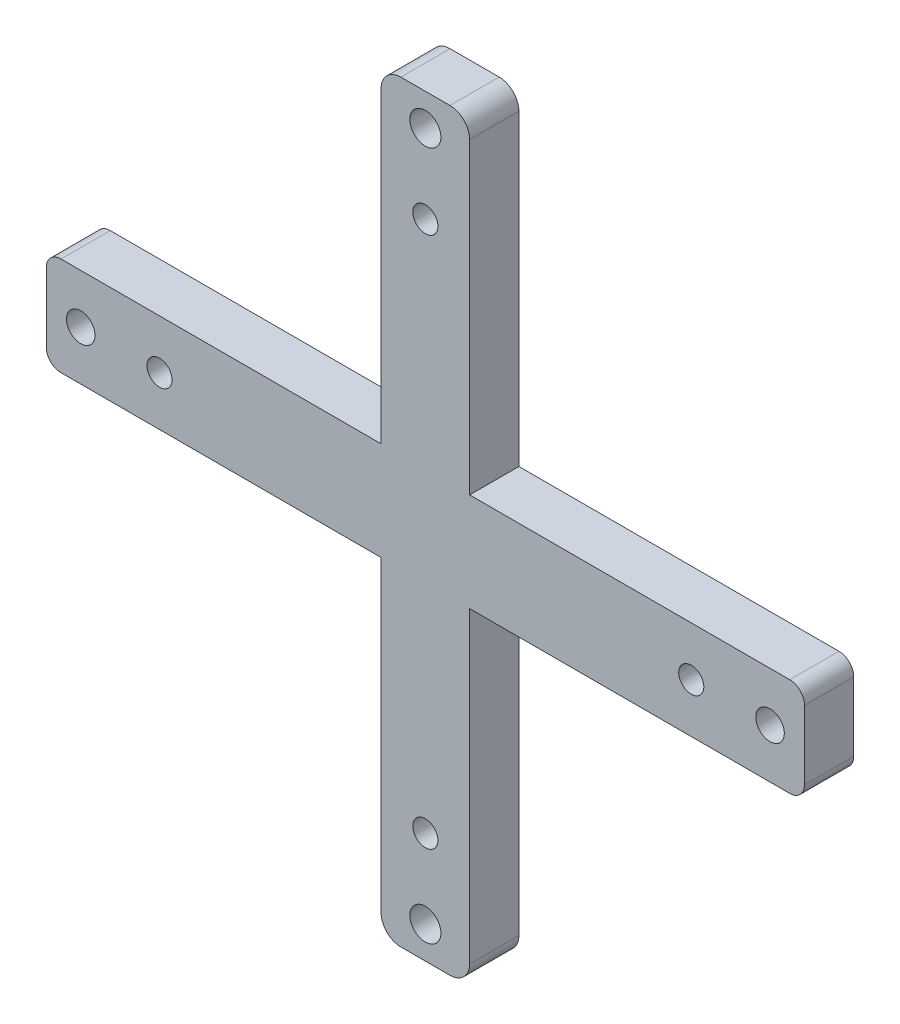
ISO-10303-21;
HEADER;
FILE_DESCRIPTION(('STEP AP214'),'2;1');
FILE_NAME('part.step','',(''),(''),'','','');
FILE_SCHEMA(('AUTOMOTIVE_DESIGN { 1 0 10303 214 1 1 1 1 }'));
ENDSEC;
DATA;
#1=APPLICATION_CONTEXT('core data for automotive mechanical design processes');
#2=APPLICATION_PROTOCOL_DEFINITION('international standard','automotive_design',2000,#1);
#3=PRODUCT_CONTEXT('',#1,'mechanical');
#4=PRODUCT('Part','Part','',(#3));
#5=PRODUCT_RELATED_PRODUCT_CATEGORY('part','',(#4));
#6=PRODUCT_DEFINITION_FORMATION('','',#4);
#7=PRODUCT_DEFINITION_CONTEXT('part definition',#1,'design');
#8=PRODUCT_DEFINITION('design','',#6,#7);
#9=PRODUCT_DEFINITION_SHAPE('','',#8);
#10=(LENGTH_UNIT() NAMED_UNIT(*) SI_UNIT(.MILLI.,.METRE.));
#11=(NAMED_UNIT(*) PLANE_ANGLE_UNIT() SI_UNIT($,.RADIAN.));
#12=(NAMED_UNIT(*) SI_UNIT($,.STERADIAN.) SOLID_ANGLE_UNIT());
#13=UNCERTAINTY_MEASURE_WITH_UNIT(LENGTH_MEASURE(1.E-05),#10,'distance_accuracy_value','');
#14=(GEOMETRIC_REPRESENTATION_CONTEXT(3) GLOBAL_UNCERTAINTY_ASSIGNED_CONTEXT((#13)) GLOBAL_UNIT_ASSIGNED_CONTEXT((#10,
#11,#12)) REPRESENTATION_CONTEXT('',''));
#15=CARTESIAN_POINT('',(0.,0.,0.));
#16=DIRECTION('',(0.,0.,1.));
#17=DIRECTION('',(1.,0.,0.));
#18=AXIS2_PLACEMENT_3D('',#15,#16,#17);
#19=CARTESIAN_POINT('',(0.,-88.9,0.));
#20=DIRECTION('',(0.,0.,1.));
#21=DIRECTION('',(1.,0.,0.));
#22=AXIS2_PLACEMENT_3D('',#19,#20,#21);
#23=CYLINDRICAL_SURFACE('',#22,4.);
#24=CARTESIAN_POINT('',(0.,-88.9,12.7));
#25=DIRECTION('',(0.,0.,1.));
#26=DIRECTION('',(1.,0.,0.));
#27=AXIS2_PLACEMENT_3D('',#24,#25,#26);
#28=CIRCLE('',#27,4.);
#29=CARTESIAN_POINT('',(4.,-88.9,12.7));
#30=VERTEX_POINT('',#29);
#31=EDGE_CURVE('E821',#30,#30,#28,.T.);
#32=ORIENTED_EDGE('',*,*,#31,.T.);
#33=EDGE_LOOP('',(#32));
#34=FACE_BOUND('',#33,.T.);
#35=CARTESIAN_POINT('',(0.,-88.9,6.35));
#36=DIRECTION('',(0.,0.,-1.));
#37=DIRECTION('',(-1.,0.,0.));
#38=AXIS2_PLACEMENT_3D('',#35,#36,#37);
#39=CIRCLE('',#38,4.);
#40=CARTESIAN_POINT('',(-4.,-88.9,6.35));
#41=VERTEX_POINT('',#40);
#42=EDGE_CURVE('E11',#41,#41,#39,.F.);
#43=ORIENTED_EDGE('',*,*,#42,.F.);
#44=EDGE_LOOP('',(#43));
#45=FACE_BOUND('',#44,.T.);
#46=ADVANCED_FACE('F36',(#34,#45),#23,.F.);
#47=CARTESIAN_POINT('',(0.,88.9,0.));
#48=DIRECTION('',(0.,0.,1.));
#49=DIRECTION('',(1.,0.,0.));
#50=AXIS2_PLACEMENT_3D('',#47,#48,#49);
#51=CYLINDRICAL_SURFACE('',#50,4.);
#52=CARTESIAN_POINT('',(0.,88.9,12.7));
#53=DIRECTION('',(0.,0.,1.));
#54=DIRECTION('',(1.,0.,0.));
#55=AXIS2_PLACEMENT_3D('',#52,#53,#54);
#56=CIRCLE('',#55,4.);
#57=CARTESIAN_POINT('',(4.,88.9,12.7));
#58=VERTEX_POINT('',#57);
#59=EDGE_CURVE('E206',#58,#58,#56,.T.);
#60=ORIENTED_EDGE('',*,*,#59,.T.);
#61=EDGE_LOOP('',(#60));
#62=FACE_BOUND('',#61,.T.);
#63=CARTESIAN_POINT('',(0.,88.9,6.35));
#64=DIRECTION('',(0.,0.,-1.));
#65=DIRECTION('',(-1.,0.,0.));
#66=AXIS2_PLACEMENT_3D('',#63,#64,#65);
#67=CIRCLE('',#66,4.);
#68=CARTESIAN_POINT('',(-4.,88.9,6.35));
#69=VERTEX_POINT('',#68);
#70=EDGE_CURVE('E44',#69,#69,#67,.F.);
#71=ORIENTED_EDGE('',*,*,#70,.F.);
#72=EDGE_LOOP('',(#71));
#73=FACE_BOUND('',#72,.T.);
#74=ADVANCED_FACE('F340',(#62,#73),#51,.F.);
#75=CARTESIAN_POINT('',(-88.9,0.,12.7));
#76=DIRECTION('',(0.,0.,-1.));
#77=DIRECTION('',(-1.,0.,0.));
#78=AXIS2_PLACEMENT_3D('',#75,#76,#77);
#79=CYLINDRICAL_SURFACE('',#78,3.683);
#80=CARTESIAN_POINT('',(-88.9,0.,12.7));
#81=DIRECTION('',(0.,0.,1.));
#82=DIRECTION('',(1.,0.,0.));
#83=AXIS2_PLACEMENT_3D('',#80,#81,#82);
#84=CIRCLE('',#83,3.683);
#85=CARTESIAN_POINT('',(-85.217,0.,12.7));
#86=VERTEX_POINT('',#85);
#87=EDGE_CURVE('E261',#86,#86,#84,.T.);
#88=ORIENTED_EDGE('',*,*,#87,.T.);
#89=EDGE_LOOP('',(#88));
#90=FACE_BOUND('',#89,.T.);
#91=CARTESIAN_POINT('',(-88.9,0.,6.35));
#92=DIRECTION('',(0.,0.,-1.));
#93=DIRECTION('',(-1.,0.,0.));
#94=AXIS2_PLACEMENT_3D('',#91,#92,#93);
#95=CIRCLE('',#94,3.68300000000001);
#96=CARTESIAN_POINT('',(-92.583,0.,6.35));
#97=VERTEX_POINT('',#96);
#98=EDGE_CURVE('E797',#97,#97,#95,.T.);
#99=ORIENTED_EDGE('',*,*,#98,.T.);
#100=EDGE_LOOP('',(#99));
#101=FACE_BOUND('',#100,.T.);
#102=ADVANCED_FACE('F342',(#90,#101),#79,.F.);
#103=CARTESIAN_POINT('',(88.9,0.,12.7));
#104=DIRECTION('',(0.,0.,-1.));
#105=DIRECTION('',(-1.,0.,0.));
#106=AXIS2_PLACEMENT_3D('',#103,#104,#105);
#107=CYLINDRICAL_SURFACE('',#106,3.683);
#108=CARTESIAN_POINT('',(88.9,0.,12.7));
#109=DIRECTION('',(0.,0.,1.));
#110=DIRECTION('',(1.,0.,0.));
#111=AXIS2_PLACEMENT_3D('',#108,#109,#110);
#112=CIRCLE('',#111,3.683);
#113=CARTESIAN_POINT('',(92.583,0.,12.7));
#114=VERTEX_POINT('',#113);
#115=EDGE_CURVE('E258',#114,#114,#112,.T.);
#116=ORIENTED_EDGE('',*,*,#115,.T.);
#117=EDGE_LOOP('',(#116));
#118=FACE_BOUND('',#117,.T.);
#119=CARTESIAN_POINT('',(88.9,0.,6.35));
#120=DIRECTION('',(0.,0.,-1.));
#121=DIRECTION('',(-1.,0.,0.));
#122=AXIS2_PLACEMENT_3D('',#119,#120,#121);
#123=CIRCLE('',#122,3.683);
#124=CARTESIAN_POINT('',(85.217,0.,6.35));
#125=VERTEX_POINT('',#124);
#126=EDGE_CURVE('E819',#125,#125,#123,.T.);
#127=ORIENTED_EDGE('',*,*,#126,.T.);
#128=EDGE_LOOP('',(#127));
#129=FACE_BOUND('',#128,.T.);
#130=ADVANCED_FACE('F349',(#118,#129),#107,.F.);
#131=CARTESIAN_POINT('',(93.98,12.7,12.7));
#132=DIRECTION('',(0.,-1.,0.));
#133=DIRECTION('',(1.,0.,0.));
#134=AXIS2_PLACEMENT_3D('',#131,#132,#133);
#135=PLANE('',#134);
#136=DIRECTION('',(-1.,0.,0.));
#137=VECTOR('',#136,1.);
#138=CARTESIAN_POINT('',(93.98,12.7,12.7));
#139=LINE('',#138,#137);
#140=CARTESIAN_POINT('',(-11.4153842055131,12.7,12.7));
#141=VERTEX_POINT('',#140);
#142=CARTESIAN_POINT('',(-93.98,12.7,12.7));
#143=VERTEX_POINT('',#142);
#144=EDGE_CURVE('E268',#141,#143,#139,.T.);
#145=ORIENTED_EDGE('',*,*,#144,.F.);
#146=DIRECTION('',(0.,0.,-1.));
#147=VECTOR('',#146,1.);
#148=CARTESIAN_POINT('',(-11.4153842055131,12.7,12.7));
#149=LINE('',#148,#147);
#150=CARTESIAN_POINT('',(-11.4153842055131,12.7,0.));
#151=VERTEX_POINT('',#150);
#152=EDGE_CURVE('E255',#141,#151,#149,.T.);
#153=ORIENTED_EDGE('',*,*,#152,.T.);
#154=DIRECTION('',(-1.,0.,0.));
#155=VECTOR('',#154,1.);
#156=CARTESIAN_POINT('',(93.98,12.7,0.));
#157=LINE('',#156,#155);
#158=CARTESIAN_POINT('',(-93.98,12.7,0.));
#159=VERTEX_POINT('',#158);
#160=EDGE_CURVE('E290',#151,#159,#157,.T.);
#161=ORIENTED_EDGE('',*,*,#160,.T.);
#162=DIRECTION('',(0.,0.,-1.));
#163=VECTOR('',#162,1.);
#164=CARTESIAN_POINT('',(-93.98,12.7,12.7));
#165=LINE('',#164,#163);
#166=EDGE_CURVE('E324',#143,#159,#165,.T.);
#167=ORIENTED_EDGE('',*,*,#166,.F.);
#168=EDGE_LOOP('',(#145,#153,#161,#167));
#169=FACE_BOUND('',#168,.T.);
#170=ADVANCED_FACE('F390',(#169),#135,.F.);
#171=CARTESIAN_POINT('',(93.98,-12.7,12.7));
#172=DIRECTION('',(0.,1.,0.));
#173=DIRECTION('',(-1.,0.,0.));
#174=AXIS2_PLACEMENT_3D('',#171,#172,#173);
#175=PLANE('',#174);
#176=DIRECTION('',(1.,0.,0.));
#177=VECTOR('',#176,1.);
#178=CARTESIAN_POINT('',(93.98,-12.7,0.));
#179=LINE('',#178,#177);
#180=CARTESIAN_POINT('',(-93.98,-12.7,0.));
#181=VERTEX_POINT('',#180);
#182=CARTESIAN_POINT('',(-11.4153842055131,-12.7,0.));
#183=VERTEX_POINT('',#182);
#184=EDGE_CURVE('E301',#181,#183,#179,.T.);
#185=ORIENTED_EDGE('',*,*,#184,.T.);
#186=DIRECTION('',(0.,0.,1.));
#187=VECTOR('',#186,1.);
#188=CARTESIAN_POINT('',(-11.4153842055131,-12.7,12.7));
#189=LINE('',#188,#187);
#190=CARTESIAN_POINT('',(-11.4153842055131,-12.7,12.7));
#191=VERTEX_POINT('',#190);
#192=EDGE_CURVE('E333',#183,#191,#189,.T.);
#193=ORIENTED_EDGE('',*,*,#192,.T.);
#194=DIRECTION('',(1.,0.,0.));
#195=VECTOR('',#194,1.);
#196=CARTESIAN_POINT('',(93.98,-12.7,12.7));
#197=LINE('',#196,#195);
#198=CARTESIAN_POINT('',(-93.98,-12.7,12.7));
#199=VERTEX_POINT('',#198);
#200=EDGE_CURVE('E280',#199,#191,#197,.T.);
#201=ORIENTED_EDGE('',*,*,#200,.F.);
#202=DIRECTION('',(0.,0.,-1.));
#203=VECTOR('',#202,1.);
#204=CARTESIAN_POINT('',(-93.98,-12.7,12.7));
#205=LINE('',#204,#203);
#206=EDGE_CURVE('E315',#199,#181,#205,.T.);
#207=ORIENTED_EDGE('',*,*,#206,.T.);
#208=EDGE_LOOP('',(#185,#193,#201,#207));
#209=FACE_BOUND('',#208,.T.);
#210=ADVANCED_FACE('F396',(#209),#175,.F.);
#211=CARTESIAN_POINT('',(93.98,8.89000000000001,12.7));
#212=DIRECTION('',(0.,0.,1.));
#213=DIRECTION('',(1.,0.,0.));
#214=AXIS2_PLACEMENT_3D('',#211,#212,#213);
#215=PLANE('',#214);
#216=CARTESIAN_POINT('',(-68.58,0.,12.7));
#217=DIRECTION('',(0.,0.,1.));
#218=DIRECTION('',(1.,0.,0.));
#219=AXIS2_PLACEMENT_3D('',#216,#217,#218);
#220=CIRCLE('',#219,3.23850000000001);
#221=CARTESIAN_POINT('',(-65.3415,0.,12.7));
#222=VERTEX_POINT('',#221);
#223=EDGE_CURVE('E794',#222,#222,#220,.T.);
#224=ORIENTED_EDGE('',*,*,#223,.F.);
#225=EDGE_LOOP('',(#224));
#226=FACE_BOUND('',#225,.T.);
#227=CARTESIAN_POINT('',(0.,68.58,12.7));
#228=DIRECTION('',(0.,0.,1.));
#229=DIRECTION('',(1.,0.,0.));
#230=AXIS2_PLACEMENT_3D('',#227,#228,#229);
#231=CIRCLE('',#230,3.2385);
#232=CARTESIAN_POINT('',(3.2385,68.58,12.7));
#233=VERTEX_POINT('',#232);
#234=EDGE_CURVE('E795',#233,#233,#231,.T.);
#235=ORIENTED_EDGE('',*,*,#234,.F.);
#236=EDGE_LOOP('',(#235));
#237=FACE_BOUND('',#236,.T.);
#238=CARTESIAN_POINT('',(68.58,0.,12.7));
#239=DIRECTION('',(0.,0.,1.));
#240=DIRECTION('',(1.,0.,0.));
#241=AXIS2_PLACEMENT_3D('',#238,#239,#240);
#242=CIRCLE('',#241,3.23850000000001);
#243=CARTESIAN_POINT('',(71.8185,0.,12.7));
#244=VERTEX_POINT('',#243);
#245=EDGE_CURVE('E805',#244,#244,#242,.T.);
#246=ORIENTED_EDGE('',*,*,#245,.F.);
#247=EDGE_LOOP('',(#246));
#248=FACE_BOUND('',#247,.T.);
#249=CARTESIAN_POINT('',(0.,-68.58,12.7));
#250=DIRECTION('',(0.,0.,1.));
#251=DIRECTION('',(1.,0.,0.));
#252=AXIS2_PLACEMENT_3D('',#249,#250,#251);
#253=CIRCLE('',#252,3.2385);
#254=CARTESIAN_POINT('',(3.2385,-68.58,12.7));
#255=VERTEX_POINT('',#254);
#256=EDGE_CURVE('E811',#255,#255,#253,.T.);
#257=ORIENTED_EDGE('',*,*,#256,.F.);
#258=EDGE_LOOP('',(#257));
#259=FACE_BOUND('',#258,.T.);
#260=CARTESIAN_POINT('',(93.98,12.7,12.7));
#261=VERTEX_POINT('',#260);
#262=CARTESIAN_POINT('',(11.4153842055131,12.7,12.7));
#263=VERTEX_POINT('',#262);
#264=EDGE_CURVE('E270',#261,#263,#139,.T.);
#265=ORIENTED_EDGE('',*,*,#264,.T.);
#266=DIRECTION('',(0.,1.,0.));
#267=VECTOR('',#266,1.);
#268=CARTESIAN_POINT('',(11.4153842055131,-92.075,12.7));
#269=LINE('',#268,#267);
#270=CARTESIAN_POINT('',(11.4153842055131,92.075,12.7));
#271=VERTEX_POINT('',#270);
#272=EDGE_CURVE('E229',#263,#271,#269,.T.);
#273=ORIENTED_EDGE('',*,*,#272,.T.);
#274=CARTESIAN_POINT('',(6.33538420551314,92.075,12.7));
#275=DIRECTION('',(0.,0.,1.));
#276=DIRECTION('',(-1.,0.,0.));
#277=AXIS2_PLACEMENT_3D('',#274,#275,#276);
#278=CIRCLE('',#277,5.08000000000001);
#279=CARTESIAN_POINT('',(6.33538420551314,97.155,12.7));
#280=VERTEX_POINT('',#279);
#281=EDGE_CURVE('E231',#271,#280,#278,.T.);
#282=ORIENTED_EDGE('',*,*,#281,.T.);
#283=DIRECTION('',(-1.,0.,0.));
#284=VECTOR('',#283,1.);
#285=CARTESIAN_POINT('',(-6.33538420551314,97.155,12.7));
#286=LINE('',#285,#284);
#287=CARTESIAN_POINT('',(-6.33538420551314,97.155,12.7));
#288=VERTEX_POINT('',#287);
#289=EDGE_CURVE('E234',#280,#288,#286,.T.);
#290=ORIENTED_EDGE('',*,*,#289,.T.);
#291=CARTESIAN_POINT('',(-6.33538420551314,92.075,12.7));
#292=DIRECTION('',(0.,0.,1.));
#293=DIRECTION('',(-1.,0.,0.));
#294=AXIS2_PLACEMENT_3D('',#291,#292,#293);
#295=CIRCLE('',#294,5.08000000000001);
#296=CARTESIAN_POINT('',(-11.4153842055131,92.075,12.7));
#297=VERTEX_POINT('',#296);
#298=EDGE_CURVE('E237',#288,#297,#295,.T.);
#299=ORIENTED_EDGE('',*,*,#298,.T.);
#300=DIRECTION('',(0.,-1.,0.));
#301=VECTOR('',#300,1.);
#302=CARTESIAN_POINT('',(-11.4153842055131,-92.075,12.7));
#303=LINE('',#302,#301);
#304=EDGE_CURVE('E51',#297,#141,#303,.T.);
#305=ORIENTED_EDGE('',*,*,#304,.T.);
#306=ORIENTED_EDGE('',*,*,#144,.T.);
#307=CARTESIAN_POINT('',(-93.98,8.88999999999999,12.7));
#308=DIRECTION('',(0.,0.,1.));
#309=DIRECTION('',(1.,0.,0.));
#310=AXIS2_PLACEMENT_3D('',#307,#308,#309);
#311=CIRCLE('',#310,3.81);
#312=CARTESIAN_POINT('',(-97.79,8.88999999999999,12.7));
#313=VERTEX_POINT('',#312);
#314=EDGE_CURVE('E273',#143,#313,#311,.T.);
#315=ORIENTED_EDGE('',*,*,#314,.T.);
#316=DIRECTION('',(0.,-1.,0.));
#317=VECTOR('',#316,1.);
#318=CARTESIAN_POINT('',(-97.79,-8.89000000000001,12.7));
#319=LINE('',#318,#317);
#320=CARTESIAN_POINT('',(-97.79,-8.89000000000001,12.7));
#321=VERTEX_POINT('',#320);
#322=EDGE_CURVE('E275',#313,#321,#319,.T.);
#323=ORIENTED_EDGE('',*,*,#322,.T.);
#324=CARTESIAN_POINT('',(-93.98,-8.89000000000001,12.7));
#325=DIRECTION('',(0.,0.,1.));
#326=DIRECTION('',(-1.,0.,0.));
#327=AXIS2_PLACEMENT_3D('',#324,#325,#326);
#328=CIRCLE('',#327,3.81);
#329=EDGE_CURVE('E277',#321,#199,#328,.T.);
#330=ORIENTED_EDGE('',*,*,#329,.T.);
#331=ORIENTED_EDGE('',*,*,#200,.T.);
#332=CARTESIAN_POINT('',(-11.4153842055131,-92.075,12.7));
#333=VERTEX_POINT('',#332);
#334=EDGE_CURVE('E203',#191,#333,#303,.T.);
#335=ORIENTED_EDGE('',*,*,#334,.T.);
#336=CARTESIAN_POINT('',(-6.33538420551314,-92.075,12.7));
#337=DIRECTION('',(0.,0.,1.));
#338=DIRECTION('',(-1.,0.,0.));
#339=AXIS2_PLACEMENT_3D('',#336,#337,#338);
#340=CIRCLE('',#339,5.07999999999999);
#341=CARTESIAN_POINT('',(-6.33538420551314,-97.155,12.7));
#342=VERTEX_POINT('',#341);
#343=EDGE_CURVE('E224',#333,#342,#340,.T.);
#344=ORIENTED_EDGE('',*,*,#343,.T.);
#345=DIRECTION('',(1.,0.,0.));
#346=VECTOR('',#345,1.);
#347=CARTESIAN_POINT('',(-6.33538420551314,-97.155,12.7));
#348=LINE('',#347,#346);
#349=CARTESIAN_POINT('',(6.33538420551314,-97.155,12.7));
#350=VERTEX_POINT('',#349);
#351=EDGE_CURVE('E179',#342,#350,#348,.T.);
#352=ORIENTED_EDGE('',*,*,#351,.T.);
#353=CARTESIAN_POINT('',(6.33538420551314,-92.075,12.7));
#354=DIRECTION('',(0.,0.,1.));
#355=DIRECTION('',(1.,0.,0.));
#356=AXIS2_PLACEMENT_3D('',#353,#354,#355);
#357=CIRCLE('',#356,5.07999999999999);
#358=CARTESIAN_POINT('',(11.4153842055131,-92.075,12.7));
#359=VERTEX_POINT('',#358);
#360=EDGE_CURVE('E227',#350,#359,#357,.T.);
#361=ORIENTED_EDGE('',*,*,#360,.T.);
#362=CARTESIAN_POINT('',(11.4153842055131,-12.7,12.7));
#363=VERTEX_POINT('',#362);
#364=EDGE_CURVE('E58',#359,#363,#269,.T.);
#365=ORIENTED_EDGE('',*,*,#364,.T.);
#366=CARTESIAN_POINT('',(93.98,-12.7,12.7));
#367=VERTEX_POINT('',#366);
#368=EDGE_CURVE('E279',#363,#367,#197,.T.);
#369=ORIENTED_EDGE('',*,*,#368,.T.);
#370=CARTESIAN_POINT('',(93.98,-8.88999999999999,12.7));
#371=DIRECTION('',(0.,0.,1.));
#372=DIRECTION('',(1.,0.,0.));
#373=AXIS2_PLACEMENT_3D('',#370,#371,#372);
#374=CIRCLE('',#373,3.81);
#375=CARTESIAN_POINT('',(97.79,-8.88999999999999,12.7));
#376=VERTEX_POINT('',#375);
#377=EDGE_CURVE('E283',#367,#376,#374,.T.);
#378=ORIENTED_EDGE('',*,*,#377,.T.);
#379=DIRECTION('',(0.,1.,0.));
#380=VECTOR('',#379,1.);
#381=CARTESIAN_POINT('',(97.79,-8.88999999999999,12.7));
#382=LINE('',#381,#380);
#383=CARTESIAN_POINT('',(97.79,8.89000000000001,12.7));
#384=VERTEX_POINT('',#383);
#385=EDGE_CURVE('E285',#376,#384,#382,.T.);
#386=ORIENTED_EDGE('',*,*,#385,.T.);
#387=CARTESIAN_POINT('',(93.98,8.89000000000001,12.7));
#388=DIRECTION('',(0.,0.,1.));
#389=DIRECTION('',(1.,0.,0.));
#390=AXIS2_PLACEMENT_3D('',#387,#388,#389);
#391=CIRCLE('',#390,3.81);
#392=EDGE_CURVE('E265',#384,#261,#391,.T.);
#393=ORIENTED_EDGE('',*,*,#392,.T.);
#394=EDGE_LOOP('',(#265,#273,#282,#290,#299,#305,#306,#315,#323,#330,#331,#335,#344,#352,#361,
#365,#369,#378,#386,#393));
#395=FACE_BOUND('',#394,.T.);
#396=ORIENTED_EDGE('',*,*,#115,.F.);
#397=EDGE_LOOP('',(#396));
#398=FACE_BOUND('',#397,.T.);
#399=ORIENTED_EDGE('',*,*,#31,.F.);
#400=EDGE_LOOP('',(#399));
#401=FACE_BOUND('',#400,.T.);
#402=ORIENTED_EDGE('',*,*,#59,.F.);
#403=EDGE_LOOP('',(#402));
#404=FACE_BOUND('',#403,.T.);
#405=ORIENTED_EDGE('',*,*,#87,.F.);
#406=EDGE_LOOP('',(#405));
#407=FACE_BOUND('',#406,.T.);
#408=ADVANCED_FACE('F393',(#226,#237,#248,#259,#395,#398,#401,#404,#407),#215,.T.);
#409=CARTESIAN_POINT('',(93.98,8.89000000000001,0.));
#410=DIRECTION('',(0.,0.,1.));
#411=DIRECTION('',(1.,0.,0.));
#412=AXIS2_PLACEMENT_3D('',#409,#410,#411);
#413=PLANE('',#412);
#414=CARTESIAN_POINT('',(-68.58,0.,0.));
#415=DIRECTION('',(0.,0.,1.));
#416=DIRECTION('',(1.,0.,0.));
#417=AXIS2_PLACEMENT_3D('',#414,#415,#416);
#418=CIRCLE('',#417,3.23850000000001);
#419=CARTESIAN_POINT('',(-65.3415,0.,0.));
#420=VERTEX_POINT('',#419);
#421=EDGE_CURVE('E791',#420,#420,#418,.T.);
#422=ORIENTED_EDGE('',*,*,#421,.T.);
#423=EDGE_LOOP('',(#422));
#424=FACE_BOUND('',#423,.T.);
#425=CARTESIAN_POINT('',(0.,68.58,0.));
#426=DIRECTION('',(0.,0.,1.));
#427=DIRECTION('',(1.,0.,0.));
#428=AXIS2_PLACEMENT_3D('',#425,#426,#427);
#429=CIRCLE('',#428,3.2385);
#430=CARTESIAN_POINT('',(3.2385,68.58,0.));
#431=VERTEX_POINT('',#430);
#432=EDGE_CURVE('E800',#431,#431,#429,.T.);
#433=ORIENTED_EDGE('',*,*,#432,.T.);
#434=EDGE_LOOP('',(#433));
#435=FACE_BOUND('',#434,.T.);
#436=CARTESIAN_POINT('',(68.58,0.,0.));
#437=DIRECTION('',(0.,0.,1.));
#438=DIRECTION('',(1.,0.,0.));
#439=AXIS2_PLACEMENT_3D('',#436,#437,#438);
#440=CIRCLE('',#439,3.23850000000001);
#441=CARTESIAN_POINT('',(71.8185,0.,0.));
#442=VERTEX_POINT('',#441);
#443=EDGE_CURVE('E808',#442,#442,#440,.T.);
#444=ORIENTED_EDGE('',*,*,#443,.T.);
#445=EDGE_LOOP('',(#444));
#446=FACE_BOUND('',#445,.T.);
#447=CARTESIAN_POINT('',(0.,-68.58,0.));
#448=DIRECTION('',(0.,0.,1.));
#449=DIRECTION('',(1.,0.,0.));
#450=AXIS2_PLACEMENT_3D('',#447,#448,#449);
#451=CIRCLE('',#450,3.2385);
#452=CARTESIAN_POINT('',(3.2385,-68.58,0.));
#453=VERTEX_POINT('',#452);
#454=EDGE_CURVE('E814',#453,#453,#451,.T.);
#455=ORIENTED_EDGE('',*,*,#454,.T.);
#456=EDGE_LOOP('',(#455));
#457=FACE_BOUND('',#456,.T.);
#458=CARTESIAN_POINT('',(11.4153842055131,-12.7,0.));
#459=VERTEX_POINT('',#458);
#460=CARTESIAN_POINT('',(93.98,-12.7,0.));
#461=VERTEX_POINT('',#460);
#462=EDGE_CURVE('E300',#459,#461,#179,.T.);
#463=ORIENTED_EDGE('',*,*,#462,.F.);
#464=DIRECTION('',(0.,1.,0.));
#465=VECTOR('',#464,1.);
#466=CARTESIAN_POINT('',(11.4153842055131,-92.075,0.));
#467=LINE('',#466,#465);
#468=CARTESIAN_POINT('',(11.4153842055131,-92.075,0.));
#469=VERTEX_POINT('',#468);
#470=EDGE_CURVE('E211',#469,#459,#467,.T.);
#471=ORIENTED_EDGE('',*,*,#470,.F.);
#472=CARTESIAN_POINT('',(6.33538420551314,-92.075,0.));
#473=DIRECTION('',(0.,0.,1.));
#474=DIRECTION('',(1.,0.,0.));
#475=AXIS2_PLACEMENT_3D('',#472,#473,#474);
#476=CIRCLE('',#475,5.07999999999999);
#477=CARTESIAN_POINT('',(6.33538420551314,-97.155,0.));
#478=VERTEX_POINT('',#477);
#479=EDGE_CURVE('E196',#478,#469,#476,.T.);
#480=ORIENTED_EDGE('',*,*,#479,.F.);
#481=DIRECTION('',(1.,0.,0.));
#482=VECTOR('',#481,1.);
#483=CARTESIAN_POINT('',(-6.33538420551314,-97.155,0.));
#484=LINE('',#483,#482);
#485=CARTESIAN_POINT('',(-6.33538420551314,-97.155,0.));
#486=VERTEX_POINT('',#485);
#487=EDGE_CURVE('E177',#486,#478,#484,.T.);
#488=ORIENTED_EDGE('',*,*,#487,.F.);
#489=CARTESIAN_POINT('',(-6.33538420551314,-92.075,0.));
#490=DIRECTION('',(0.,0.,1.));
#491=DIRECTION('',(-1.,0.,0.));
#492=AXIS2_PLACEMENT_3D('',#489,#490,#491);
#493=CIRCLE('',#492,5.07999999999999);
#494=CARTESIAN_POINT('',(-11.4153842055131,-92.075,0.));
#495=VERTEX_POINT('',#494);
#496=EDGE_CURVE('E193',#495,#486,#493,.T.);
#497=ORIENTED_EDGE('',*,*,#496,.F.);
#498=DIRECTION('',(0.,-1.,0.));
#499=VECTOR('',#498,1.);
#500=CARTESIAN_POINT('',(-11.4153842055131,-92.075,0.));
#501=LINE('',#500,#499);
#502=EDGE_CURVE('E222',#183,#495,#501,.T.);
#503=ORIENTED_EDGE('',*,*,#502,.F.);
#504=ORIENTED_EDGE('',*,*,#184,.F.);
#505=CARTESIAN_POINT('',(-93.98,-8.89000000000001,0.));
#506=DIRECTION('',(0.,0.,1.));
#507=DIRECTION('',(-1.,0.,0.));
#508=AXIS2_PLACEMENT_3D('',#505,#506,#507);
#509=CIRCLE('',#508,3.81);
#510=CARTESIAN_POINT('',(-97.79,-8.89000000000001,0.));
#511=VERTEX_POINT('',#510);
#512=EDGE_CURVE('E298',#511,#181,#509,.T.);
#513=ORIENTED_EDGE('',*,*,#512,.F.);
#514=DIRECTION('',(0.,-1.,0.));
#515=VECTOR('',#514,1.);
#516=CARTESIAN_POINT('',(-97.79,-8.89000000000001,0.));
#517=LINE('',#516,#515);
#518=CARTESIAN_POINT('',(-97.79,8.88999999999999,0.));
#519=VERTEX_POINT('',#518);
#520=EDGE_CURVE('E296',#519,#511,#517,.T.);
#521=ORIENTED_EDGE('',*,*,#520,.F.);
#522=CARTESIAN_POINT('',(-93.98,8.88999999999999,0.));
#523=DIRECTION('',(0.,0.,1.));
#524=DIRECTION('',(1.,0.,0.));
#525=AXIS2_PLACEMENT_3D('',#522,#523,#524);
#526=CIRCLE('',#525,3.81);
#527=EDGE_CURVE('E294',#159,#519,#526,.T.);
#528=ORIENTED_EDGE('',*,*,#527,.F.);
#529=ORIENTED_EDGE('',*,*,#160,.F.);
#530=CARTESIAN_POINT('',(-11.4153842055131,92.075,0.));
#531=VERTEX_POINT('',#530);
#532=EDGE_CURVE('E185',#531,#151,#501,.T.);
#533=ORIENTED_EDGE('',*,*,#532,.F.);
#534=CARTESIAN_POINT('',(-6.33538420551314,92.075,0.));
#535=DIRECTION('',(0.,0.,1.));
#536=DIRECTION('',(-1.,0.,0.));
#537=AXIS2_PLACEMENT_3D('',#534,#535,#536);
#538=CIRCLE('',#537,5.08000000000001);
#539=CARTESIAN_POINT('',(-6.33538420551314,97.155,0.));
#540=VERTEX_POINT('',#539);
#541=EDGE_CURVE('E219',#540,#531,#538,.T.);
#542=ORIENTED_EDGE('',*,*,#541,.F.);
#543=DIRECTION('',(-1.,0.,0.));
#544=VECTOR('',#543,1.);
#545=CARTESIAN_POINT('',(-6.33538420551314,97.155,0.));
#546=LINE('',#545,#544);
#547=CARTESIAN_POINT('',(6.33538420551314,97.155,0.));
#548=VERTEX_POINT('',#547);
#549=EDGE_CURVE('E216',#548,#540,#546,.T.);
#550=ORIENTED_EDGE('',*,*,#549,.F.);
#551=CARTESIAN_POINT('',(6.33538420551314,92.075,0.));
#552=DIRECTION('',(0.,0.,1.));
#553=DIRECTION('',(-1.,0.,0.));
#554=AXIS2_PLACEMENT_3D('',#551,#552,#553);
#555=CIRCLE('',#554,5.08000000000001);
#556=CARTESIAN_POINT('',(11.4153842055131,92.075,0.));
#557=VERTEX_POINT('',#556);
#558=EDGE_CURVE('E213',#557,#548,#555,.T.);
#559=ORIENTED_EDGE('',*,*,#558,.F.);
#560=CARTESIAN_POINT('',(11.4153842055131,12.7,0.));
#561=VERTEX_POINT('',#560);
#562=EDGE_CURVE('E210',#561,#557,#467,.T.);
#563=ORIENTED_EDGE('',*,*,#562,.F.);
#564=CARTESIAN_POINT('',(93.98,12.7,0.));
#565=VERTEX_POINT('',#564);
#566=EDGE_CURVE('E291',#565,#561,#157,.T.);
#567=ORIENTED_EDGE('',*,*,#566,.F.);
#568=CARTESIAN_POINT('',(93.98,8.89000000000001,0.));
#569=DIRECTION('',(0.,0.,1.));
#570=DIRECTION('',(1.,0.,0.));
#571=AXIS2_PLACEMENT_3D('',#568,#569,#570);
#572=CIRCLE('',#571,3.81);
#573=CARTESIAN_POINT('',(97.79,8.89000000000001,0.));
#574=VERTEX_POINT('',#573);
#575=EDGE_CURVE('E264',#574,#565,#572,.T.);
#576=ORIENTED_EDGE('',*,*,#575,.F.);
#577=DIRECTION('',(0.,1.,0.));
#578=VECTOR('',#577,1.);
#579=CARTESIAN_POINT('',(97.79,-8.88999999999999,0.));
#580=LINE('',#579,#578);
#581=CARTESIAN_POINT('',(97.79,-8.88999999999999,0.));
#582=VERTEX_POINT('',#581);
#583=EDGE_CURVE('E269',#582,#574,#580,.T.);
#584=ORIENTED_EDGE('',*,*,#583,.F.);
#585=CARTESIAN_POINT('',(93.98,-8.88999999999999,0.));
#586=DIRECTION('',(0.,0.,1.));
#587=DIRECTION('',(1.,0.,0.));
#588=AXIS2_PLACEMENT_3D('',#585,#586,#587);
#589=CIRCLE('',#588,3.81);
#590=EDGE_CURVE('E304',#461,#582,#589,.T.);
#591=ORIENTED_EDGE('',*,*,#590,.F.);
#592=EDGE_LOOP('',(#463,#471,#480,#488,#497,#503,#504,#513,#521,#528,#529,#533,#542,#550,#559,
#563,#567,#576,#584,#591));
#593=FACE_BOUND('',#592,.T.);
#594=ADVANCED_FACE('F191',(#424,#435,#446,#457,#593),#413,.F.);
#595=CARTESIAN_POINT('',(93.98,8.89000000000001,12.7));
#596=DIRECTION('',(0.,0.,-1.));
#597=DIRECTION('',(-1.,0.,0.));
#598=AXIS2_PLACEMENT_3D('',#595,#596,#597);
#599=CYLINDRICAL_SURFACE('',#598,3.81);
#600=ORIENTED_EDGE('',*,*,#575,.T.);
#601=DIRECTION('',(0.,0.,-1.));
#602=VECTOR('',#601,1.);
#603=CARTESIAN_POINT('',(93.98,12.7,12.7));
#604=LINE('',#603,#602);
#605=EDGE_CURVE('E327',#261,#565,#604,.T.);
#606=ORIENTED_EDGE('',*,*,#605,.F.);
#607=ORIENTED_EDGE('',*,*,#392,.F.);
#608=DIRECTION('',(0.,0.,-1.));
#609=VECTOR('',#608,1.);
#610=CARTESIAN_POINT('',(97.79,8.89000000000001,12.7));
#611=LINE('',#610,#609);
#612=EDGE_CURVE('E287',#384,#574,#611,.T.);
#613=ORIENTED_EDGE('',*,*,#612,.T.);
#614=EDGE_LOOP('',(#600,#606,#607,#613));
#615=FACE_BOUND('',#614,.T.);
#616=ADVANCED_FACE('F38',(#615),#599,.T.);
#617=ORIENTED_EDGE('',*,*,#566,.T.);
#618=DIRECTION('',(0.,0.,1.));
#619=VECTOR('',#618,1.);
#620=CARTESIAN_POINT('',(11.4153842055131,12.7,12.7));
#621=LINE('',#620,#619);
#622=EDGE_CURVE('E240',#561,#263,#621,.T.);
#623=ORIENTED_EDGE('',*,*,#622,.T.);
#624=ORIENTED_EDGE('',*,*,#264,.F.);
#625=ORIENTED_EDGE('',*,*,#605,.T.);
#626=EDGE_LOOP('',(#617,#623,#624,#625));
#627=FACE_BOUND('',#626,.T.);
#628=ADVANCED_FACE('F422',(#627),#135,.F.);
#629=CARTESIAN_POINT('',(-93.98,8.88999999999999,12.7));
#630=DIRECTION('',(0.,0.,-1.));
#631=DIRECTION('',(-1.,0.,0.));
#632=AXIS2_PLACEMENT_3D('',#629,#630,#631);
#633=CYLINDRICAL_SURFACE('',#632,3.81);
#634=ORIENTED_EDGE('',*,*,#527,.T.);
#635=DIRECTION('',(0.,0.,-1.));
#636=VECTOR('',#635,1.);
#637=CARTESIAN_POINT('',(-97.79,8.88999999999999,12.7));
#638=LINE('',#637,#636);
#639=EDGE_CURVE('E321',#313,#519,#638,.T.);
#640=ORIENTED_EDGE('',*,*,#639,.F.);
#641=ORIENTED_EDGE('',*,*,#314,.F.);
#642=ORIENTED_EDGE('',*,*,#166,.T.);
#643=EDGE_LOOP('',(#634,#640,#641,#642));
#644=FACE_BOUND('',#643,.T.);
#645=ADVANCED_FACE('F419',(#644),#633,.T.);
#646=CARTESIAN_POINT('',(-97.79,-8.89000000000001,12.7));
#647=DIRECTION('',(1.,0.,0.));
#648=DIRECTION('',(0.,0.,-1.));
#649=AXIS2_PLACEMENT_3D('',#646,#647,#648);
#650=PLANE('',#649);
#651=ORIENTED_EDGE('',*,*,#520,.T.);
#652=DIRECTION('',(0.,0.,-1.));
#653=VECTOR('',#652,1.);
#654=CARTESIAN_POINT('',(-97.79,-8.89000000000001,12.7));
#655=LINE('',#654,#653);
#656=EDGE_CURVE('E318',#321,#511,#655,.T.);
#657=ORIENTED_EDGE('',*,*,#656,.F.);
#658=ORIENTED_EDGE('',*,*,#322,.F.);
#659=ORIENTED_EDGE('',*,*,#639,.T.);
#660=EDGE_LOOP('',(#651,#657,#658,#659));
#661=FACE_BOUND('',#660,.T.);
#662=ADVANCED_FACE('F415',(#661),#650,.F.);
#663=CARTESIAN_POINT('',(-93.98,-8.89000000000001,12.7));
#664=DIRECTION('',(0.,0.,-1.));
#665=DIRECTION('',(-1.,0.,0.));
#666=AXIS2_PLACEMENT_3D('',#663,#664,#665);
#667=CYLINDRICAL_SURFACE('',#666,3.81);
#668=ORIENTED_EDGE('',*,*,#512,.T.);
#669=ORIENTED_EDGE('',*,*,#206,.F.);
#670=ORIENTED_EDGE('',*,*,#329,.F.);
#671=ORIENTED_EDGE('',*,*,#656,.T.);
#672=EDGE_LOOP('',(#668,#669,#670,#671));
#673=FACE_BOUND('',#672,.T.);
#674=ADVANCED_FACE('F411',(#673),#667,.T.);
#675=ORIENTED_EDGE('',*,*,#368,.F.);
#676=DIRECTION('',(0.,0.,-1.));
#677=VECTOR('',#676,1.);
#678=CARTESIAN_POINT('',(11.4153842055131,-12.7,12.7));
#679=LINE('',#678,#677);
#680=EDGE_CURVE('E330',#363,#459,#679,.T.);
#681=ORIENTED_EDGE('',*,*,#680,.T.);
#682=ORIENTED_EDGE('',*,*,#462,.T.);
#683=DIRECTION('',(0.,0.,-1.));
#684=VECTOR('',#683,1.);
#685=CARTESIAN_POINT('',(93.98,-12.7,12.7));
#686=LINE('',#685,#684);
#687=EDGE_CURVE('E312',#367,#461,#686,.T.);
#688=ORIENTED_EDGE('',*,*,#687,.F.);
#689=EDGE_LOOP('',(#675,#681,#682,#688));
#690=FACE_BOUND('',#689,.T.);
#691=ADVANCED_FACE('F407',(#690),#175,.F.);
#692=CARTESIAN_POINT('',(93.98,-8.88999999999999,12.7));
#693=DIRECTION('',(0.,0.,-1.));
#694=DIRECTION('',(-1.,0.,0.));
#695=AXIS2_PLACEMENT_3D('',#692,#693,#694);
#696=CYLINDRICAL_SURFACE('',#695,3.81);
#697=ORIENTED_EDGE('',*,*,#590,.T.);
#698=DIRECTION('',(0.,0.,-1.));
#699=VECTOR('',#698,1.);
#700=CARTESIAN_POINT('',(97.79,-8.88999999999999,12.7));
#701=LINE('',#700,#699);
#702=EDGE_CURVE('E309',#376,#582,#701,.T.);
#703=ORIENTED_EDGE('',*,*,#702,.F.);
#704=ORIENTED_EDGE('',*,*,#377,.F.);
#705=ORIENTED_EDGE('',*,*,#687,.T.);
#706=EDGE_LOOP('',(#697,#703,#704,#705));
#707=FACE_BOUND('',#706,.T.);
#708=ADVANCED_FACE('F403',(#707),#696,.T.);
#709=CARTESIAN_POINT('',(97.79,-8.88999999999999,12.7));
#710=DIRECTION('',(-1.,0.,0.));
#711=DIRECTION('',(0.,0.,1.));
#712=AXIS2_PLACEMENT_3D('',#709,#710,#711);
#713=PLANE('',#712);
#714=ORIENTED_EDGE('',*,*,#583,.T.);
#715=ORIENTED_EDGE('',*,*,#612,.F.);
#716=ORIENTED_EDGE('',*,*,#385,.F.);
#717=ORIENTED_EDGE('',*,*,#702,.T.);
#718=EDGE_LOOP('',(#714,#715,#716,#717));
#719=FACE_BOUND('',#718,.T.);
#720=ADVANCED_FACE('F383',(#719),#713,.F.);
#721=CARTESIAN_POINT('',(6.33538420551314,-92.075,0.));
#722=DIRECTION('',(0.,0.,1.));
#723=DIRECTION('',(1.,0.,0.));
#724=AXIS2_PLACEMENT_3D('',#721,#722,#723);
#725=CYLINDRICAL_SURFACE('',#724,5.07999999999999);
#726=ORIENTED_EDGE('',*,*,#360,.F.);
#727=DIRECTION('',(0.,0.,1.));
#728=VECTOR('',#727,1.);
#729=CARTESIAN_POINT('',(6.33538420551314,-97.155,0.));
#730=LINE('',#729,#728);
#731=EDGE_CURVE('E184',#478,#350,#730,.T.);
#732=ORIENTED_EDGE('',*,*,#731,.F.);
#733=ORIENTED_EDGE('',*,*,#479,.T.);
#734=DIRECTION('',(0.,0.,1.));
#735=VECTOR('',#734,1.);
#736=CARTESIAN_POINT('',(11.4153842055131,-92.075,0.));
#737=LINE('',#736,#735);
#738=EDGE_CURVE('E250',#469,#359,#737,.T.);
#739=ORIENTED_EDGE('',*,*,#738,.T.);
#740=EDGE_LOOP('',(#726,#732,#733,#739));
#741=FACE_BOUND('',#740,.T.);
#742=ADVANCED_FACE('F380',(#741),#725,.T.);
#743=CARTESIAN_POINT('',(-6.33538420551314,-97.155,0.));
#744=DIRECTION('',(0.,-1.,0.));
#745=DIRECTION('',(0.,0.,-1.));
#746=AXIS2_PLACEMENT_3D('',#743,#744,#745);
#747=PLANE('',#746);
#748=ORIENTED_EDGE('',*,*,#351,.F.);
#749=DIRECTION('',(0.,0.,1.));
#750=VECTOR('',#749,1.);
#751=CARTESIAN_POINT('',(-6.33538420551314,-97.155,0.));
#752=LINE('',#751,#750);
#753=EDGE_CURVE('E174',#486,#342,#752,.T.);
#754=ORIENTED_EDGE('',*,*,#753,.F.);
#755=ORIENTED_EDGE('',*,*,#487,.T.);
#756=ORIENTED_EDGE('',*,*,#731,.T.);
#757=EDGE_LOOP('',(#748,#754,#755,#756));
#758=FACE_BOUND('',#757,.T.);
#759=ADVANCED_FACE('F176',(#758),#747,.T.);
#760=CARTESIAN_POINT('',(-6.33538420551314,-92.075,0.));
#761=DIRECTION('',(0.,0.,1.));
#762=DIRECTION('',(1.,0.,0.));
#763=AXIS2_PLACEMENT_3D('',#760,#761,#762);
#764=CYLINDRICAL_SURFACE('',#763,5.07999999999999);
#765=ORIENTED_EDGE('',*,*,#343,.F.);
#766=DIRECTION('',(0.,0.,1.));
#767=VECTOR('',#766,1.);
#768=CARTESIAN_POINT('',(-11.4153842055131,-92.075,0.));
#769=LINE('',#768,#767);
#770=EDGE_CURVE('E201',#495,#333,#769,.T.);
#771=ORIENTED_EDGE('',*,*,#770,.F.);
#772=ORIENTED_EDGE('',*,*,#496,.T.);
#773=ORIENTED_EDGE('',*,*,#753,.T.);
#774=EDGE_LOOP('',(#765,#771,#772,#773));
#775=FACE_BOUND('',#774,.T.);
#776=ADVANCED_FACE('F199',(#775),#764,.T.);
#777=CARTESIAN_POINT('',(11.4153842055131,-92.075,0.));
#778=DIRECTION('',(1.,0.,0.));
#779=DIRECTION('',(0.,0.,-1.));
#780=AXIS2_PLACEMENT_3D('',#777,#778,#779);
#781=PLANE('',#780);
#782=ORIENTED_EDGE('',*,*,#680,.F.);
#783=ORIENTED_EDGE('',*,*,#364,.F.);
#784=ORIENTED_EDGE('',*,*,#738,.F.);
#785=ORIENTED_EDGE('',*,*,#470,.T.);
#786=EDGE_LOOP('',(#782,#783,#784,#785));
#787=FACE_BOUND('',#786,.T.);
#788=ADVANCED_FACE('F379',(#787),#781,.T.);
#789=CARTESIAN_POINT('',(-11.4153842055131,-92.075,0.));
#790=DIRECTION('',(-1.,0.,0.));
#791=DIRECTION('',(0.,0.,1.));
#792=AXIS2_PLACEMENT_3D('',#789,#790,#791);
#793=PLANE('',#792);
#794=ORIENTED_EDGE('',*,*,#192,.F.);
#795=ORIENTED_EDGE('',*,*,#502,.T.);
#796=ORIENTED_EDGE('',*,*,#770,.T.);
#797=ORIENTED_EDGE('',*,*,#334,.F.);
#798=EDGE_LOOP('',(#794,#795,#796,#797));
#799=FACE_BOUND('',#798,.T.);
#800=ADVANCED_FACE('F361',(#799),#793,.T.);
#801=ORIENTED_EDGE('',*,*,#152,.F.);
#802=ORIENTED_EDGE('',*,*,#304,.F.);
#803=DIRECTION('',(0.,0.,1.));
#804=VECTOR('',#803,1.);
#805=CARTESIAN_POINT('',(-11.4153842055131,92.075,0.));
#806=LINE('',#805,#804);
#807=EDGE_CURVE('E241',#531,#297,#806,.T.);
#808=ORIENTED_EDGE('',*,*,#807,.F.);
#809=ORIENTED_EDGE('',*,*,#532,.T.);
#810=EDGE_LOOP('',(#801,#802,#808,#809));
#811=FACE_BOUND('',#810,.T.);
#812=ADVANCED_FACE('F357',(#811),#793,.T.);
#813=ORIENTED_EDGE('',*,*,#622,.F.);
#814=ORIENTED_EDGE('',*,*,#562,.T.);
#815=DIRECTION('',(0.,0.,1.));
#816=VECTOR('',#815,1.);
#817=CARTESIAN_POINT('',(11.4153842055131,92.075,0.));
#818=LINE('',#817,#816);
#819=EDGE_CURVE('E247',#557,#271,#818,.T.);
#820=ORIENTED_EDGE('',*,*,#819,.T.);
#821=ORIENTED_EDGE('',*,*,#272,.F.);
#822=EDGE_LOOP('',(#813,#814,#820,#821));
#823=FACE_BOUND('',#822,.T.);
#824=ADVANCED_FACE('F360',(#823),#781,.T.);
#825=CARTESIAN_POINT('',(-6.33538420551314,92.075,0.));
#826=DIRECTION('',(0.,0.,1.));
#827=DIRECTION('',(1.,0.,0.));
#828=AXIS2_PLACEMENT_3D('',#825,#826,#827);
#829=CYLINDRICAL_SURFACE('',#828,5.08000000000001);
#830=ORIENTED_EDGE('',*,*,#298,.F.);
#831=DIRECTION('',(0.,0.,1.));
#832=VECTOR('',#831,1.);
#833=CARTESIAN_POINT('',(-6.33538420551314,97.155,0.));
#834=LINE('',#833,#832);
#835=EDGE_CURVE('E243',#540,#288,#834,.T.);
#836=ORIENTED_EDGE('',*,*,#835,.F.);
#837=ORIENTED_EDGE('',*,*,#541,.T.);
#838=ORIENTED_EDGE('',*,*,#807,.T.);
#839=EDGE_LOOP('',(#830,#836,#837,#838));
#840=FACE_BOUND('',#839,.T.);
#841=ADVANCED_FACE('F363',(#840),#829,.T.);
#842=CARTESIAN_POINT('',(-6.33538420551314,97.155,0.));
#843=DIRECTION('',(0.,1.,0.));
#844=DIRECTION('',(0.,0.,1.));
#845=AXIS2_PLACEMENT_3D('',#842,#843,#844);
#846=PLANE('',#845);
#847=ORIENTED_EDGE('',*,*,#289,.F.);
#848=DIRECTION('',(0.,0.,1.));
#849=VECTOR('',#848,1.);
#850=CARTESIAN_POINT('',(6.33538420551314,97.155,0.));
#851=LINE('',#850,#849);
#852=EDGE_CURVE('E245',#548,#280,#851,.T.);
#853=ORIENTED_EDGE('',*,*,#852,.F.);
#854=ORIENTED_EDGE('',*,*,#549,.T.);
#855=ORIENTED_EDGE('',*,*,#835,.T.);
#856=EDGE_LOOP('',(#847,#853,#854,#855));
#857=FACE_BOUND('',#856,.T.);
#858=ADVANCED_FACE('F366',(#857),#846,.T.);
#859=CARTESIAN_POINT('',(6.33538420551314,92.075,0.));
#860=DIRECTION('',(0.,0.,1.));
#861=DIRECTION('',(1.,0.,0.));
#862=AXIS2_PLACEMENT_3D('',#859,#860,#861);
#863=CYLINDRICAL_SURFACE('',#862,5.08000000000001);
#864=ORIENTED_EDGE('',*,*,#281,.F.);
#865=ORIENTED_EDGE('',*,*,#819,.F.);
#866=ORIENTED_EDGE('',*,*,#558,.T.);
#867=ORIENTED_EDGE('',*,*,#852,.T.);
#868=EDGE_LOOP('',(#864,#865,#866,#867));
#869=FACE_BOUND('',#868,.T.);
#870=ADVANCED_FACE('F370',(#869),#863,.T.);
#871=CARTESIAN_POINT('',(88.9,0.,6.35));
#872=DIRECTION('',(0.,0.,-1.));
#873=DIRECTION('',(-1.,0.,0.));
#874=AXIS2_PLACEMENT_3D('',#871,#872,#873);
#875=PLANE('',#874);
#876=ORIENTED_EDGE('',*,*,#126,.F.);
#877=EDGE_LOOP('',(#876));
#878=FACE_BOUND('',#877,.T.);
#879=ADVANCED_FACE('F374',(#878),#875,.F.);
#880=CARTESIAN_POINT('',(-88.9,0.,6.35));
#881=DIRECTION('',(0.,0.,-1.));
#882=DIRECTION('',(-1.,0.,0.));
#883=AXIS2_PLACEMENT_3D('',#880,#881,#882);
#884=PLANE('',#883);
#885=ORIENTED_EDGE('',*,*,#98,.F.);
#886=EDGE_LOOP('',(#885));
#887=FACE_BOUND('',#886,.T.);
#888=ADVANCED_FACE('F507',(#887),#884,.F.);
#889=CARTESIAN_POINT('',(0.,88.9,6.35));
#890=DIRECTION('',(0.,0.,-1.));
#891=DIRECTION('',(-1.,0.,0.));
#892=AXIS2_PLACEMENT_3D('',#889,#890,#891);
#893=PLANE('',#892);
#894=ORIENTED_EDGE('',*,*,#70,.T.);
#895=EDGE_LOOP('',(#894));
#896=FACE_BOUND('',#895,.T.);
#897=ADVANCED_FACE('F338',(#896),#893,.F.);
#898=CARTESIAN_POINT('',(0.,-88.9,6.35));
#899=DIRECTION('',(0.,0.,-1.));
#900=DIRECTION('',(-1.,0.,0.));
#901=AXIS2_PLACEMENT_3D('',#898,#899,#900);
#902=PLANE('',#901);
#903=ORIENTED_EDGE('',*,*,#42,.T.);
#904=EDGE_LOOP('',(#903));
#905=FACE_BOUND('',#904,.T.);
#906=ADVANCED_FACE('F522',(#905),#902,.F.);
#907=CARTESIAN_POINT('',(0.,-68.58,0.));
#908=DIRECTION('',(0.,0.,1.));
#909=DIRECTION('',(1.,0.,0.));
#910=AXIS2_PLACEMENT_3D('',#907,#908,#909);
#911=CYLINDRICAL_SURFACE('',#910,3.2385);
#912=ORIENTED_EDGE('',*,*,#454,.F.);
#913=EDGE_LOOP('',(#912));
#914=FACE_BOUND('',#913,.T.);
#915=ORIENTED_EDGE('',*,*,#256,.T.);
#916=EDGE_LOOP('',(#915));
#917=FACE_BOUND('',#916,.T.);
#918=ADVANCED_FACE('F529',(#914,#917),#911,.F.);
#919=CARTESIAN_POINT('',(68.58,0.,0.));
#920=DIRECTION('',(0.,0.,1.));
#921=DIRECTION('',(1.,0.,0.));
#922=AXIS2_PLACEMENT_3D('',#919,#920,#921);
#923=CYLINDRICAL_SURFACE('',#922,3.23850000000001);
#924=ORIENTED_EDGE('',*,*,#443,.F.);
#925=EDGE_LOOP('',(#924));
#926=FACE_BOUND('',#925,.T.);
#927=ORIENTED_EDGE('',*,*,#245,.T.);
#928=EDGE_LOOP('',(#927));
#929=FACE_BOUND('',#928,.T.);
#930=ADVANCED_FACE('F537',(#926,#929),#923,.F.);
#931=CARTESIAN_POINT('',(0.,68.58,0.));
#932=DIRECTION('',(0.,0.,1.));
#933=DIRECTION('',(1.,0.,0.));
#934=AXIS2_PLACEMENT_3D('',#931,#932,#933);
#935=CYLINDRICAL_SURFACE('',#934,3.2385);
#936=ORIENTED_EDGE('',*,*,#432,.F.);
#937=EDGE_LOOP('',(#936));
#938=FACE_BOUND('',#937,.T.);
#939=ORIENTED_EDGE('',*,*,#234,.T.);
#940=EDGE_LOOP('',(#939));
#941=FACE_BOUND('',#940,.T.);
#942=ADVANCED_FACE('F545',(#938,#941),#935,.F.);
#943=CARTESIAN_POINT('',(-68.58,0.,0.));
#944=DIRECTION('',(0.,0.,1.));
#945=DIRECTION('',(1.,0.,0.));
#946=AXIS2_PLACEMENT_3D('',#943,#944,#945);
#947=CYLINDRICAL_SURFACE('',#946,3.23850000000001);
#948=ORIENTED_EDGE('',*,*,#421,.F.);
#949=EDGE_LOOP('',(#948));
#950=FACE_BOUND('',#949,.T.);
#951=ORIENTED_EDGE('',*,*,#223,.T.);
#952=EDGE_LOOP('',(#951));
#953=FACE_BOUND('',#952,.T.);
#954=ADVANCED_FACE('F553',(#950,#953),#947,.F.);
#955=CLOSED_SHELL('',(#46,#74,#102,#130,#170,#210,#408,#594,#616,#628,#645,#662,#674,#691,#708,
#720,#742,#759,#776,#788,#800,#812,#824,#841,#858,#870,#879,#888,#897,#906,#918,#930,#942,#954));
#956=MANIFOLD_SOLID_BREP('B2',#955);
#957=ADVANCED_BREP_SHAPE_REPRESENTATION('',(#18,#956),#14);
#958=SHAPE_DEFINITION_REPRESENTATION(#9,#957);
ENDSEC;
END-ISO-10303-21;
